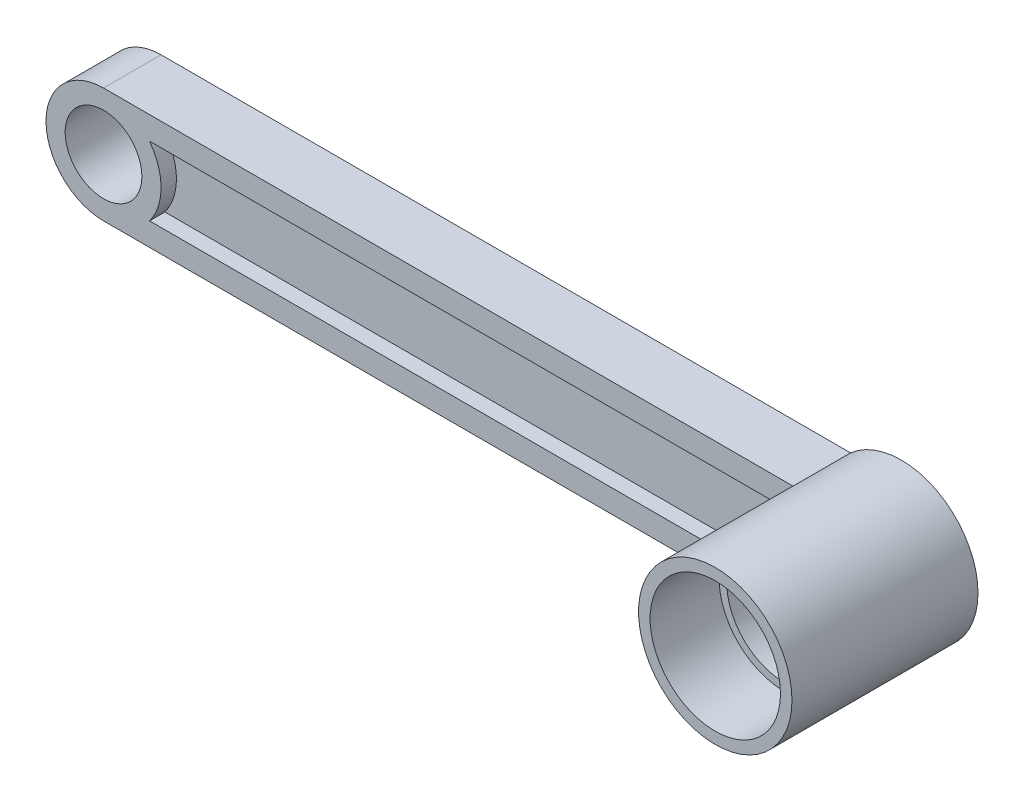
ISO-10303-21;
HEADER;
FILE_DESCRIPTION(('STEP AP214'),'2;1');
FILE_NAME('part.step','',(''),(''),'','','');
FILE_SCHEMA(('AUTOMOTIVE_DESIGN { 1 0 10303 214 1 1 1 1 }'));
ENDSEC;
DATA;
#1=APPLICATION_CONTEXT('core data for automotive mechanical design processes');
#2=APPLICATION_PROTOCOL_DEFINITION('international standard','automotive_design',2000,#1);
#3=PRODUCT_CONTEXT('',#1,'mechanical');
#4=PRODUCT('Part','Part','',(#3));
#5=PRODUCT_RELATED_PRODUCT_CATEGORY('part','',(#4));
#6=PRODUCT_DEFINITION_FORMATION('','',#4);
#7=PRODUCT_DEFINITION_CONTEXT('part definition',#1,'design');
#8=PRODUCT_DEFINITION('design','',#6,#7);
#9=PRODUCT_DEFINITION_SHAPE('','',#8);
#10=(LENGTH_UNIT() NAMED_UNIT(*) SI_UNIT(.MILLI.,.METRE.));
#11=(NAMED_UNIT(*) PLANE_ANGLE_UNIT() SI_UNIT($,.RADIAN.));
#12=(NAMED_UNIT(*) SI_UNIT($,.STERADIAN.) SOLID_ANGLE_UNIT());
#13=UNCERTAINTY_MEASURE_WITH_UNIT(LENGTH_MEASURE(1.E-05),#10,'distance_accuracy_value','');
#14=(GEOMETRIC_REPRESENTATION_CONTEXT(3) GLOBAL_UNCERTAINTY_ASSIGNED_CONTEXT((#13)) GLOBAL_UNIT_ASSIGNED_CONTEXT((#10,
#11,#12)) REPRESENTATION_CONTEXT('',''));
#15=CARTESIAN_POINT('',(0.,0.,0.));
#16=DIRECTION('',(0.,0.,1.));
#17=DIRECTION('',(1.,0.,0.));
#18=AXIS2_PLACEMENT_3D('',#15,#16,#17);
#19=CARTESIAN_POINT('',(-48.25,0.,-3.75));
#20=DIRECTION('',(0.,0.,-1.));
#21=DIRECTION('',(-1.,0.,0.));
#22=AXIS2_PLACEMENT_3D('',#19,#20,#21);
#23=PLANE('',#22);
#24=CARTESIAN_POINT('',(48.25,0.,-3.75));
#25=DIRECTION('',(0.,0.,-1.));
#26=DIRECTION('',(-1.,0.,0.));
#27=AXIS2_PLACEMENT_3D('',#24,#25,#26);
#28=CIRCLE('',#27,5.5);
#29=CARTESIAN_POINT('',(42.75,0.,-3.75));
#30=VERTEX_POINT('',#29);
#31=EDGE_CURVE('E213',#30,#30,#28,.T.);
#32=ORIENTED_EDGE('',*,*,#31,.F.);
#33=EDGE_LOOP('',(#32));
#34=FACE_BOUND('',#33,.T.);
#35=DIRECTION('',(1.,0.,0.));
#36=VECTOR('',#35,1.);
#37=CARTESIAN_POINT('',(-48.25,7.5,-3.75));
#38=LINE('',#37,#36);
#39=CARTESIAN_POINT('',(-48.25,7.5,-3.75));
#40=VERTEX_POINT('',#39);
#41=CARTESIAN_POINT('',(41.6356217223385,7.5,-3.75));
#42=VERTEX_POINT('',#41);
#43=EDGE_CURVE('E169',#40,#42,#38,.T.);
#44=ORIENTED_EDGE('',*,*,#43,.T.);
#45=CARTESIAN_POINT('',(48.25,0.,-3.75));
#46=DIRECTION('',(0.,0.,1.));
#47=DIRECTION('',(1.,0.,0.));
#48=AXIS2_PLACEMENT_3D('',#45,#46,#47);
#49=CIRCLE('',#48,10.);
#50=CARTESIAN_POINT('',(41.6356217223385,-7.5,-3.75));
#51=VERTEX_POINT('',#50);
#52=EDGE_CURVE('E142',#51,#42,#49,.T.);
#53=ORIENTED_EDGE('',*,*,#52,.F.);
#54=DIRECTION('',(1.,0.,0.));
#55=VECTOR('',#54,1.);
#56=CARTESIAN_POINT('',(-48.25,-7.5,-3.75));
#57=LINE('',#56,#55);
#58=CARTESIAN_POINT('',(-48.25,-7.5,-3.75));
#59=VERTEX_POINT('',#58);
#60=EDGE_CURVE('E48',#59,#51,#57,.T.);
#61=ORIENTED_EDGE('',*,*,#60,.F.);
#62=CARTESIAN_POINT('',(-48.25,0.,-3.75));
#63=DIRECTION('',(0.,0.,1.));
#64=DIRECTION('',(1.,0.,0.));
#65=AXIS2_PLACEMENT_3D('',#62,#63,#64);
#66=CIRCLE('',#65,7.5);
#67=EDGE_CURVE('E162',#40,#59,#66,.T.);
#68=ORIENTED_EDGE('',*,*,#67,.F.);
#69=EDGE_LOOP('',(#44,#53,#61,#68));
#70=FACE_BOUND('',#69,.T.);
#71=CARTESIAN_POINT('',(-48.25,0.,-3.75));
#72=DIRECTION('',(0.,0.,1.));
#73=DIRECTION('',(1.,0.,0.));
#74=AXIS2_PLACEMENT_3D('',#71,#72,#73);
#75=CIRCLE('',#74,5.);
#76=CARTESIAN_POINT('',(-43.25,0.,-3.75));
#77=VERTEX_POINT('',#76);
#78=EDGE_CURVE('E159',#77,#77,#75,.T.);
#79=ORIENTED_EDGE('',*,*,#78,.T.);
#80=EDGE_LOOP('',(#79));
#81=FACE_BOUND('',#80,.T.);
#82=ADVANCED_FACE('F41',(#34,#70,#81),#23,.T.);
#83=CARTESIAN_POINT('',(-48.25,-7.5,3.75));
#84=DIRECTION('',(0.,-1.,0.));
#85=DIRECTION('',(0.,0.,-1.));
#86=AXIS2_PLACEMENT_3D('',#83,#84,#85);
#87=PLANE('',#86);
#88=DIRECTION('',(0.,0.,1.));
#89=VECTOR('',#88,1.);
#90=CARTESIAN_POINT('',(41.6356217223385,-7.5,-3.75));
#91=LINE('',#90,#89);
#92=CARTESIAN_POINT('',(41.6356217223385,-7.5,3.75));
#93=VERTEX_POINT('',#92);
#94=EDGE_CURVE('E152',#93,#51,#91,.F.);
#95=ORIENTED_EDGE('',*,*,#94,.F.);
#96=DIRECTION('',(1.,0.,0.));
#97=VECTOR('',#96,1.);
#98=CARTESIAN_POINT('',(-48.25,-7.5,3.75));
#99=LINE('',#98,#97);
#100=CARTESIAN_POINT('',(-48.25,-7.5,3.75));
#101=VERTEX_POINT('',#100);
#102=EDGE_CURVE('E171',#101,#93,#99,.T.);
#103=ORIENTED_EDGE('',*,*,#102,.F.);
#104=DIRECTION('',(0.,0.,-1.));
#105=VECTOR('',#104,1.);
#106=CARTESIAN_POINT('',(-48.25,-7.5,3.75));
#107=LINE('',#106,#105);
#108=EDGE_CURVE('E167',#101,#59,#107,.T.);
#109=ORIENTED_EDGE('',*,*,#108,.T.);
#110=ORIENTED_EDGE('',*,*,#60,.T.);
#111=EDGE_LOOP('',(#95,#103,#109,#110));
#112=FACE_BOUND('',#111,.T.);
#113=ADVANCED_FACE('F188',(#112),#87,.T.);
#114=CARTESIAN_POINT('',(-48.25,7.5,3.75));
#115=DIRECTION('',(0.,0.,1.));
#116=DIRECTION('',(1.,0.,0.));
#117=AXIS2_PLACEMENT_3D('',#114,#115,#116);
#118=PLANE('',#117);
#119=DIRECTION('',(1.,0.,0.));
#120=VECTOR('',#119,1.);
#121=CARTESIAN_POINT('',(0.,-4.5,3.75));
#122=LINE('',#121,#120);
#123=CARTESIAN_POINT('',(-42.25,-4.5,3.75));
#124=VERTEX_POINT('',#123);
#125=CARTESIAN_POINT('',(39.3197144502541,-4.5,3.75));
#126=VERTEX_POINT('',#125);
#127=EDGE_CURVE('E55',#124,#126,#122,.T.);
#128=ORIENTED_EDGE('',*,*,#127,.F.);
#129=CARTESIAN_POINT('',(-48.25,0.,3.75));
#130=DIRECTION('',(0.,0.,-1.));
#131=DIRECTION('',(-1.,0.,0.));
#132=AXIS2_PLACEMENT_3D('',#129,#130,#131);
#133=CIRCLE('',#132,7.5);
#134=CARTESIAN_POINT('',(-42.25,4.5,3.75));
#135=VERTEX_POINT('',#134);
#136=EDGE_CURVE('E136',#135,#124,#133,.T.);
#137=ORIENTED_EDGE('',*,*,#136,.F.);
#138=DIRECTION('',(-1.,0.,0.));
#139=VECTOR('',#138,1.);
#140=CARTESIAN_POINT('',(0.,4.5,3.75));
#141=LINE('',#140,#139);
#142=CARTESIAN_POINT('',(39.3197144502541,4.5,3.75));
#143=VERTEX_POINT('',#142);
#144=EDGE_CURVE('E121',#143,#135,#141,.T.);
#145=ORIENTED_EDGE('',*,*,#144,.F.);
#146=CARTESIAN_POINT('',(48.25,0.,3.75));
#147=DIRECTION('',(0.,0.,1.));
#148=DIRECTION('',(1.,0.,0.));
#149=AXIS2_PLACEMENT_3D('',#146,#147,#148);
#150=CIRCLE('',#149,10.);
#151=CARTESIAN_POINT('',(41.6356217223385,7.5,3.75));
#152=VERTEX_POINT('',#151);
#153=EDGE_CURVE('E149',#152,#143,#150,.T.);
#154=ORIENTED_EDGE('',*,*,#153,.F.);
#155=DIRECTION('',(1.,0.,0.));
#156=VECTOR('',#155,1.);
#157=CARTESIAN_POINT('',(-48.25,7.5,3.75));
#158=LINE('',#157,#156);
#159=CARTESIAN_POINT('',(-48.25,7.5,3.75));
#160=VERTEX_POINT('',#159);
#161=EDGE_CURVE('E174',#160,#152,#158,.T.);
#162=ORIENTED_EDGE('',*,*,#161,.F.);
#163=CARTESIAN_POINT('',(-48.25,0.,3.75));
#164=DIRECTION('',(0.,0.,1.));
#165=DIRECTION('',(1.,0.,0.));
#166=AXIS2_PLACEMENT_3D('',#163,#164,#165);
#167=CIRCLE('',#166,7.5);
#168=EDGE_CURVE('E157',#160,#101,#167,.T.);
#169=ORIENTED_EDGE('',*,*,#168,.T.);
#170=ORIENTED_EDGE('',*,*,#102,.T.);
#171=EDGE_CURVE('E148',#126,#93,#150,.T.);
#172=ORIENTED_EDGE('',*,*,#171,.F.);
#173=EDGE_LOOP('',(#128,#137,#145,#154,#162,#169,#170,#172));
#174=FACE_BOUND('',#173,.T.);
#175=CARTESIAN_POINT('',(-48.25,0.,3.75));
#176=DIRECTION('',(0.,0.,1.));
#177=DIRECTION('',(1.,0.,0.));
#178=AXIS2_PLACEMENT_3D('',#175,#176,#177);
#179=CIRCLE('',#178,5.);
#180=CARTESIAN_POINT('',(-43.25,0.,3.75));
#181=VERTEX_POINT('',#180);
#182=EDGE_CURVE('E154',#181,#181,#179,.T.);
#183=ORIENTED_EDGE('',*,*,#182,.F.);
#184=EDGE_LOOP('',(#183));
#185=FACE_BOUND('',#184,.T.);
#186=ADVANCED_FACE('F190',(#174,#185),#118,.T.);
#187=CARTESIAN_POINT('',(-48.25,7.5,-3.75));
#188=DIRECTION('',(0.,1.,0.));
#189=DIRECTION('',(0.,0.,1.));
#190=AXIS2_PLACEMENT_3D('',#187,#188,#189);
#191=PLANE('',#190);
#192=DIRECTION('',(0.,0.,1.));
#193=VECTOR('',#192,1.);
#194=CARTESIAN_POINT('',(41.6356217223385,7.5,-3.75));
#195=LINE('',#194,#193);
#196=EDGE_CURVE('E11',#42,#152,#195,.T.);
#197=ORIENTED_EDGE('',*,*,#196,.F.);
#198=ORIENTED_EDGE('',*,*,#43,.F.);
#199=DIRECTION('',(0.,0.,1.));
#200=VECTOR('',#199,1.);
#201=CARTESIAN_POINT('',(-48.25,7.5,-3.75));
#202=LINE('',#201,#200);
#203=EDGE_CURVE('E164',#40,#160,#202,.T.);
#204=ORIENTED_EDGE('',*,*,#203,.T.);
#205=ORIENTED_EDGE('',*,*,#161,.T.);
#206=EDGE_LOOP('',(#197,#198,#204,#205));
#207=FACE_BOUND('',#206,.T.);
#208=ADVANCED_FACE('F196',(#207),#191,.T.);
#209=CARTESIAN_POINT('',(-48.25,0.,-3.75));
#210=DIRECTION('',(0.,0.,1.));
#211=DIRECTION('',(1.,0.,0.));
#212=AXIS2_PLACEMENT_3D('',#209,#210,#211);
#213=CYLINDRICAL_SURFACE('',#212,7.5);
#214=ORIENTED_EDGE('',*,*,#203,.F.);
#215=ORIENTED_EDGE('',*,*,#67,.T.);
#216=ORIENTED_EDGE('',*,*,#108,.F.);
#217=ORIENTED_EDGE('',*,*,#168,.F.);
#218=EDGE_LOOP('',(#214,#215,#216,#217));
#219=FACE_BOUND('',#218,.T.);
#220=ADVANCED_FACE('F195',(#219),#213,.T.);
#221=CARTESIAN_POINT('',(-48.25,0.,-3.75));
#222=DIRECTION('',(0.,0.,1.));
#223=DIRECTION('',(1.,0.,0.));
#224=AXIS2_PLACEMENT_3D('',#221,#222,#223);
#225=CYLINDRICAL_SURFACE('',#224,5.);
#226=ORIENTED_EDGE('',*,*,#78,.F.);
#227=EDGE_LOOP('',(#226));
#228=FACE_BOUND('',#227,.T.);
#229=ORIENTED_EDGE('',*,*,#182,.T.);
#230=EDGE_LOOP('',(#229));
#231=FACE_BOUND('',#230,.T.);
#232=ADVANCED_FACE('F202',(#228,#231),#225,.F.);
#233=CARTESIAN_POINT('',(48.25,0.,-3.75));
#234=DIRECTION('',(0.,0.,1.));
#235=DIRECTION('',(1.,0.,0.));
#236=AXIS2_PLACEMENT_3D('',#233,#234,#235);
#237=CYLINDRICAL_SURFACE('',#236,10.);
#238=ORIENTED_EDGE('',*,*,#153,.T.);
#239=DIRECTION('',(0.,0.,1.));
#240=VECTOR('',#239,1.);
#241=CARTESIAN_POINT('',(39.3197144502541,4.5,1.75));
#242=LINE('',#241,#240);
#243=CARTESIAN_POINT('',(39.3197144502541,4.5,1.75));
#244=VERTEX_POINT('',#243);
#245=EDGE_CURVE('E140',#244,#143,#242,.T.);
#246=ORIENTED_EDGE('',*,*,#245,.F.);
#247=CARTESIAN_POINT('',(48.25,0.,1.75));
#248=DIRECTION('',(0.,0.,-1.));
#249=DIRECTION('',(-1.,0.,0.));
#250=AXIS2_PLACEMENT_3D('',#247,#248,#249);
#251=CIRCLE('',#250,10.);
#252=CARTESIAN_POINT('',(39.3197144502541,-4.5,1.75));
#253=VERTEX_POINT('',#252);
#254=EDGE_CURVE('E114',#253,#244,#251,.T.);
#255=ORIENTED_EDGE('',*,*,#254,.F.);
#256=DIRECTION('',(0.,0.,1.));
#257=VECTOR('',#256,1.);
#258=CARTESIAN_POINT('',(39.3197144502541,-4.5,1.75));
#259=LINE('',#258,#257);
#260=EDGE_CURVE('E143',#253,#126,#259,.T.);
#261=ORIENTED_EDGE('',*,*,#260,.T.);
#262=ORIENTED_EDGE('',*,*,#171,.T.);
#263=ORIENTED_EDGE('',*,*,#94,.T.);
#264=ORIENTED_EDGE('',*,*,#52,.T.);
#265=ORIENTED_EDGE('',*,*,#196,.T.);
#266=EDGE_LOOP('',(#238,#246,#255,#261,#262,#263,#264,#265));
#267=FACE_BOUND('',#266,.T.);
#268=CARTESIAN_POINT('',(48.25,0.,20.5));
#269=DIRECTION('',(0.,0.,1.));
#270=DIRECTION('',(1.,0.,0.));
#271=AXIS2_PLACEMENT_3D('',#268,#269,#270);
#272=CIRCLE('',#271,10.);
#273=CARTESIAN_POINT('',(58.25,0.,20.5));
#274=VERTEX_POINT('',#273);
#275=EDGE_CURVE('E230',#274,#274,#272,.T.);
#276=ORIENTED_EDGE('',*,*,#275,.F.);
#277=EDGE_LOOP('',(#276));
#278=FACE_BOUND('',#277,.T.);
#279=ADVANCED_FACE('F184',(#267,#278),#237,.T.);
#280=CARTESIAN_POINT('',(0.,-4.5,1.75));
#281=DIRECTION('',(0.,-1.,0.));
#282=DIRECTION('',(0.,0.,-1.));
#283=AXIS2_PLACEMENT_3D('',#280,#281,#282);
#284=PLANE('',#283);
#285=ORIENTED_EDGE('',*,*,#127,.T.);
#286=ORIENTED_EDGE('',*,*,#260,.F.);
#287=DIRECTION('',(1.,0.,0.));
#288=VECTOR('',#287,1.);
#289=CARTESIAN_POINT('',(0.,-4.5,1.75));
#290=LINE('',#289,#288);
#291=CARTESIAN_POINT('',(-42.25,-4.5,1.75));
#292=VERTEX_POINT('',#291);
#293=EDGE_CURVE('E129',#292,#253,#290,.T.);
#294=ORIENTED_EDGE('',*,*,#293,.F.);
#295=DIRECTION('',(0.,0.,1.));
#296=VECTOR('',#295,1.);
#297=CARTESIAN_POINT('',(-42.25,-4.5,1.75));
#298=LINE('',#297,#296);
#299=EDGE_CURVE('E125',#292,#124,#298,.T.);
#300=ORIENTED_EDGE('',*,*,#299,.T.);
#301=EDGE_LOOP('',(#285,#286,#294,#300));
#302=FACE_BOUND('',#301,.T.);
#303=ADVANCED_FACE('F271',(#302),#284,.F.);
#304=CARTESIAN_POINT('',(-48.25,0.,1.75));
#305=DIRECTION('',(0.,0.,1.));
#306=DIRECTION('',(1.,0.,0.));
#307=AXIS2_PLACEMENT_3D('',#304,#305,#306);
#308=CYLINDRICAL_SURFACE('',#307,7.5);
#309=ORIENTED_EDGE('',*,*,#136,.T.);
#310=ORIENTED_EDGE('',*,*,#299,.F.);
#311=CARTESIAN_POINT('',(-48.25,0.,1.75));
#312=DIRECTION('',(0.,0.,-1.));
#313=DIRECTION('',(-1.,0.,0.));
#314=AXIS2_PLACEMENT_3D('',#311,#312,#313);
#315=CIRCLE('',#314,7.5);
#316=CARTESIAN_POINT('',(-42.25,4.5,1.75));
#317=VERTEX_POINT('',#316);
#318=EDGE_CURVE('E112',#317,#292,#315,.T.);
#319=ORIENTED_EDGE('',*,*,#318,.F.);
#320=DIRECTION('',(0.,0.,1.));
#321=VECTOR('',#320,1.);
#322=CARTESIAN_POINT('',(-42.25,4.5,1.75));
#323=LINE('',#322,#321);
#324=EDGE_CURVE('E118',#317,#135,#323,.T.);
#325=ORIENTED_EDGE('',*,*,#324,.T.);
#326=EDGE_LOOP('',(#309,#310,#319,#325));
#327=FACE_BOUND('',#326,.T.);
#328=ADVANCED_FACE('F127',(#327),#308,.T.);
#329=CARTESIAN_POINT('',(0.,4.5,1.75));
#330=DIRECTION('',(0.,1.,0.));
#331=DIRECTION('',(0.,0.,1.));
#332=AXIS2_PLACEMENT_3D('',#329,#330,#331);
#333=PLANE('',#332);
#334=ORIENTED_EDGE('',*,*,#144,.T.);
#335=ORIENTED_EDGE('',*,*,#324,.F.);
#336=DIRECTION('',(-1.,0.,0.));
#337=VECTOR('',#336,1.);
#338=CARTESIAN_POINT('',(0.,4.5,1.75));
#339=LINE('',#338,#337);
#340=EDGE_CURVE('E108',#244,#317,#339,.T.);
#341=ORIENTED_EDGE('',*,*,#340,.F.);
#342=ORIENTED_EDGE('',*,*,#245,.T.);
#343=EDGE_LOOP('',(#334,#335,#341,#342));
#344=FACE_BOUND('',#343,.T.);
#345=ADVANCED_FACE('F119',(#344),#333,.F.);
#346=CARTESIAN_POINT('',(48.25,0.,1.75));
#347=DIRECTION('',(0.,0.,-1.));
#348=DIRECTION('',(-1.,0.,0.));
#349=AXIS2_PLACEMENT_3D('',#346,#347,#348);
#350=PLANE('',#349);
#351=ORIENTED_EDGE('',*,*,#340,.T.);
#352=ORIENTED_EDGE('',*,*,#318,.T.);
#353=ORIENTED_EDGE('',*,*,#293,.T.);
#354=ORIENTED_EDGE('',*,*,#254,.T.);
#355=EDGE_LOOP('',(#351,#352,#353,#354));
#356=FACE_BOUND('',#355,.T.);
#357=ADVANCED_FACE('F110',(#356),#350,.F.);
#358=CARTESIAN_POINT('',(48.25,0.,20.5));
#359=DIRECTION('',(0.,0.,1.));
#360=DIRECTION('',(1.,0.,0.));
#361=AXIS2_PLACEMENT_3D('',#358,#359,#360);
#362=PLANE('',#361);
#363=ORIENTED_EDGE('',*,*,#275,.T.);
#364=EDGE_LOOP('',(#363));
#365=FACE_BOUND('',#364,.T.);
#366=CARTESIAN_POINT('',(48.25,0.,20.5));
#367=DIRECTION('',(0.,0.,1.));
#368=DIRECTION('',(1.,0.,0.));
#369=AXIS2_PLACEMENT_3D('',#366,#367,#368);
#370=CIRCLE('',#369,8.5);
#371=CARTESIAN_POINT('',(56.75,0.,20.5));
#372=VERTEX_POINT('',#371);
#373=EDGE_CURVE('E227',#372,#372,#370,.T.);
#374=ORIENTED_EDGE('',*,*,#373,.F.);
#375=EDGE_LOOP('',(#374));
#376=FACE_BOUND('',#375,.T.);
#377=ADVANCED_FACE('F252',(#365,#376),#362,.T.);
#378=CARTESIAN_POINT('',(48.25,0.,20.5));
#379=DIRECTION('',(0.,0.,-1.));
#380=DIRECTION('',(-1.,0.,0.));
#381=AXIS2_PLACEMENT_3D('',#378,#379,#380);
#382=CYLINDRICAL_SURFACE('',#381,8.5);
#383=ORIENTED_EDGE('',*,*,#373,.T.);
#384=EDGE_LOOP('',(#383));
#385=FACE_BOUND('',#384,.T.);
#386=CARTESIAN_POINT('',(48.25,0.,11.5));
#387=DIRECTION('',(0.,0.,1.));
#388=DIRECTION('',(1.,0.,0.));
#389=AXIS2_PLACEMENT_3D('',#386,#387,#388);
#390=CIRCLE('',#389,8.5);
#391=CARTESIAN_POINT('',(56.75,0.,11.5));
#392=VERTEX_POINT('',#391);
#393=EDGE_CURVE('E226',#392,#392,#390,.T.);
#394=ORIENTED_EDGE('',*,*,#393,.F.);
#395=EDGE_LOOP('',(#394));
#396=FACE_BOUND('',#395,.T.);
#397=ADVANCED_FACE('F249',(#385,#396),#382,.F.);
#398=CARTESIAN_POINT('',(48.25,0.,6.5));
#399=DIRECTION('',(0.,0.,1.));
#400=DIRECTION('',(1.,0.,0.));
#401=AXIS2_PLACEMENT_3D('',#398,#399,#400);
#402=PLANE('',#401);
#403=CARTESIAN_POINT('',(48.25,0.,6.5));
#404=DIRECTION('',(0.,0.,1.));
#405=DIRECTION('',(1.,0.,0.));
#406=AXIS2_PLACEMENT_3D('',#403,#404,#405);
#407=CIRCLE('',#406,2.95);
#408=CARTESIAN_POINT('',(51.2,0.,6.5));
#409=VERTEX_POINT('',#408);
#410=EDGE_CURVE('E219',#409,#409,#407,.T.);
#411=ORIENTED_EDGE('',*,*,#410,.F.);
#412=EDGE_LOOP('',(#411));
#413=FACE_BOUND('',#412,.T.);
#414=CARTESIAN_POINT('',(48.25,0.,6.5));
#415=DIRECTION('',(0.,0.,1.));
#416=DIRECTION('',(1.,0.,0.));
#417=AXIS2_PLACEMENT_3D('',#414,#415,#416);
#418=CIRCLE('',#417,7.5);
#419=CARTESIAN_POINT('',(55.75,0.,6.5));
#420=VERTEX_POINT('',#419);
#421=EDGE_CURVE('E137',#420,#420,#418,.T.);
#422=ORIENTED_EDGE('',*,*,#421,.T.);
#423=EDGE_LOOP('',(#422));
#424=FACE_BOUND('',#423,.T.);
#425=ADVANCED_FACE('F251',(#413,#424),#402,.T.);
#426=CARTESIAN_POINT('',(48.25,0.,6.5));
#427=DIRECTION('',(0.,0.,1.));
#428=DIRECTION('',(1.,0.,0.));
#429=AXIS2_PLACEMENT_3D('',#426,#427,#428);
#430=CYLINDRICAL_SURFACE('',#429,7.5);
#431=ORIENTED_EDGE('',*,*,#421,.F.);
#432=EDGE_LOOP('',(#431));
#433=FACE_BOUND('',#432,.T.);
#434=CARTESIAN_POINT('',(48.25,0.,11.5));
#435=DIRECTION('',(0.,0.,1.));
#436=DIRECTION('',(1.,0.,0.));
#437=AXIS2_PLACEMENT_3D('',#434,#435,#436);
#438=CIRCLE('',#437,7.5);
#439=CARTESIAN_POINT('',(55.75,0.,11.5));
#440=VERTEX_POINT('',#439);
#441=EDGE_CURVE('E235',#440,#440,#438,.T.);
#442=ORIENTED_EDGE('',*,*,#441,.T.);
#443=EDGE_LOOP('',(#442));
#444=FACE_BOUND('',#443,.T.);
#445=ADVANCED_FACE('F240',(#433,#444),#430,.F.);
#446=CARTESIAN_POINT('',(48.25,0.,11.5));
#447=DIRECTION('',(0.,0.,1.));
#448=DIRECTION('',(1.,0.,0.));
#449=AXIS2_PLACEMENT_3D('',#446,#447,#448);
#450=PLANE('',#449);
#451=ORIENTED_EDGE('',*,*,#441,.F.);
#452=EDGE_LOOP('',(#451));
#453=FACE_BOUND('',#452,.T.);
#454=ORIENTED_EDGE('',*,*,#393,.T.);
#455=EDGE_LOOP('',(#454));
#456=FACE_BOUND('',#455,.T.);
#457=ADVANCED_FACE('F242',(#453,#456),#450,.T.);
#458=CARTESIAN_POINT('',(48.25,0.,4.5));
#459=DIRECTION('',(0.,0.,1.));
#460=DIRECTION('',(1.,0.,0.));
#461=AXIS2_PLACEMENT_3D('',#458,#459,#460);
#462=CYLINDRICAL_SURFACE('',#461,2.95);
#463=ORIENTED_EDGE('',*,*,#410,.T.);
#464=EDGE_LOOP('',(#463));
#465=FACE_BOUND('',#464,.T.);
#466=CARTESIAN_POINT('',(48.25,0.,2.25));
#467=DIRECTION('',(0.,0.,-1.));
#468=DIRECTION('',(-1.,0.,0.));
#469=AXIS2_PLACEMENT_3D('',#466,#467,#468);
#470=CIRCLE('',#469,2.95);
#471=CARTESIAN_POINT('',(45.3,0.,2.25));
#472=VERTEX_POINT('',#471);
#473=EDGE_CURVE('E216',#472,#472,#470,.T.);
#474=ORIENTED_EDGE('',*,*,#473,.T.);
#475=EDGE_LOOP('',(#474));
#476=FACE_BOUND('',#475,.T.);
#477=ADVANCED_FACE('F245',(#465,#476),#462,.F.);
#478=CARTESIAN_POINT('',(48.25,0.,2.25));
#479=DIRECTION('',(0.,0.,-1.));
#480=DIRECTION('',(-1.,0.,0.));
#481=AXIS2_PLACEMENT_3D('',#478,#479,#480);
#482=CYLINDRICAL_SURFACE('',#481,5.5);
#483=CARTESIAN_POINT('',(48.25,0.,2.25));
#484=DIRECTION('',(0.,0.,-1.));
#485=DIRECTION('',(-1.,0.,0.));
#486=AXIS2_PLACEMENT_3D('',#483,#484,#485);
#487=CIRCLE('',#486,5.5);
#488=CARTESIAN_POINT('',(42.75,0.,2.25));
#489=VERTEX_POINT('',#488);
#490=EDGE_CURVE('E215',#489,#489,#487,.T.);
#491=ORIENTED_EDGE('',*,*,#490,.F.);
#492=EDGE_LOOP('',(#491));
#493=FACE_BOUND('',#492,.T.);
#494=ORIENTED_EDGE('',*,*,#31,.T.);
#495=EDGE_LOOP('',(#494));
#496=FACE_BOUND('',#495,.T.);
#497=ADVANCED_FACE('F350',(#493,#496),#482,.F.);
#498=CARTESIAN_POINT('',(48.25,0.,2.25));
#499=DIRECTION('',(0.,0.,-1.));
#500=DIRECTION('',(-1.,0.,0.));
#501=AXIS2_PLACEMENT_3D('',#498,#499,#500);
#502=PLANE('',#501);
#503=ORIENTED_EDGE('',*,*,#473,.F.);
#504=EDGE_LOOP('',(#503));
#505=FACE_BOUND('',#504,.T.);
#506=ORIENTED_EDGE('',*,*,#490,.T.);
#507=EDGE_LOOP('',(#506));
#508=FACE_BOUND('',#507,.T.);
#509=ADVANCED_FACE('F355',(#505,#508),#502,.T.);
#510=CLOSED_SHELL('',(#82,#113,#186,#208,#220,#232,#279,#303,#328,#345,#357,#377,#397,#425,#445,
#457,#477,#497,#509));
#511=MANIFOLD_SOLID_BREP('B2',#510);
#512=ADVANCED_BREP_SHAPE_REPRESENTATION('',(#18,#511),#14);
#513=SHAPE_DEFINITION_REPRESENTATION(#9,#512);
ENDSEC;
END-ISO-10303-21;
